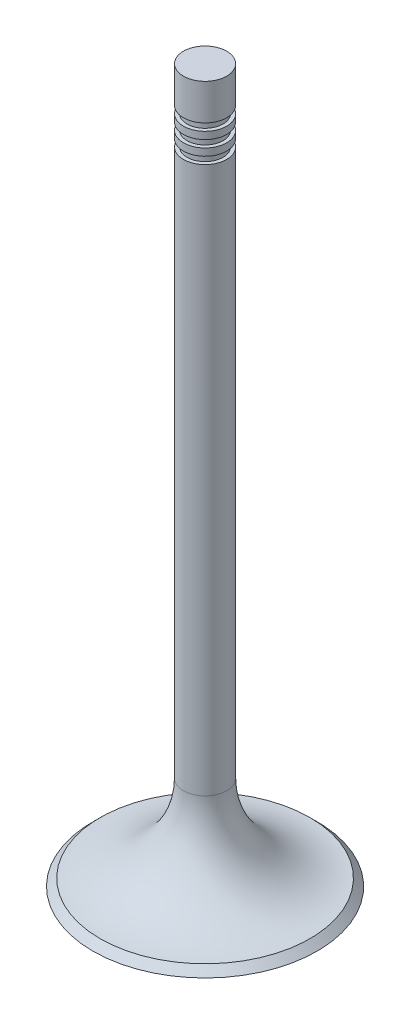
ISO-10303-21;
HEADER;
FILE_DESCRIPTION(('STEP AP214'),'2;1');
FILE_NAME('part.step','',(''),(''),'','','');
FILE_SCHEMA(('AUTOMOTIVE_DESIGN { 1 0 10303 214 1 1 1 1 }'));
ENDSEC;
DATA;
#1=APPLICATION_CONTEXT('core data for automotive mechanical design processes');
#2=APPLICATION_PROTOCOL_DEFINITION('international standard','automotive_design',2000,#1);
#3=PRODUCT_CONTEXT('',#1,'mechanical');
#4=PRODUCT('Part','Part','',(#3));
#5=PRODUCT_RELATED_PRODUCT_CATEGORY('part','',(#4));
#6=PRODUCT_DEFINITION_FORMATION('','',#4);
#7=PRODUCT_DEFINITION_CONTEXT('part definition',#1,'design');
#8=PRODUCT_DEFINITION('design','',#6,#7);
#9=PRODUCT_DEFINITION_SHAPE('','',#8);
#10=(LENGTH_UNIT() NAMED_UNIT(*) SI_UNIT(.MILLI.,.METRE.));
#11=(NAMED_UNIT(*) PLANE_ANGLE_UNIT() SI_UNIT($,.RADIAN.));
#12=(NAMED_UNIT(*) SI_UNIT($,.STERADIAN.) SOLID_ANGLE_UNIT());
#13=UNCERTAINTY_MEASURE_WITH_UNIT(LENGTH_MEASURE(1.E-05),#10,'distance_accuracy_value','');
#14=(GEOMETRIC_REPRESENTATION_CONTEXT(3) GLOBAL_UNCERTAINTY_ASSIGNED_CONTEXT((#13)) GLOBAL_UNIT_ASSIGNED_CONTEXT((#10,
#11,#12)) REPRESENTATION_CONTEXT('',''));
#15=CARTESIAN_POINT('',(0.,0.,0.));
#16=DIRECTION('',(0.,0.,1.));
#17=DIRECTION('',(1.,0.,0.));
#18=AXIS2_PLACEMENT_3D('',#15,#16,#17);
#19=CARTESIAN_POINT('',(0.,0.,0.));
#20=DIRECTION('',(0.,1.,0.));
#21=DIRECTION('',(0.,0.,1.));
#22=AXIS2_PLACEMENT_3D('',#19,#20,#21);
#23=PLANE('',#22);
#24=CARTESIAN_POINT('',(0.,0.,0.));
#25=DIRECTION('',(0.,1.,0.));
#26=DIRECTION('',(0.,0.,1.));
#27=AXIS2_PLACEMENT_3D('',#24,#25,#26);
#28=CIRCLE('',#27,15.55);
#29=CARTESIAN_POINT('',(0.,0.,15.55));
#30=VERTEX_POINT('',#29);
#31=EDGE_CURVE('E58',#30,#30,#28,.T.);
#32=ORIENTED_EDGE('',*,*,#31,.F.);
#33=EDGE_LOOP('',(#32));
#34=FACE_BOUND('',#33,.T.);
#35=ADVANCED_FACE('F45',(#34),#23,.F.);
#36=CARTESIAN_POINT('',(0.,1.,0.));
#37=DIRECTION('',(0.,-1.,0.));
#38=DIRECTION('',(0.,0.,-1.));
#39=AXIS2_PLACEMENT_3D('',#36,#37,#38);
#40=CONICAL_SURFACE('',#39,14.55,0.785398163397446);
#41=ORIENTED_EDGE('',*,*,#31,.T.);
#42=EDGE_LOOP('',(#41));
#43=FACE_BOUND('',#42,.T.);
#44=CARTESIAN_POINT('',(0.,1.,0.));
#45=DIRECTION('',(0.,1.,0.));
#46=DIRECTION('',(0.,0.,1.));
#47=AXIS2_PLACEMENT_3D('',#44,#45,#46);
#48=CIRCLE('',#47,14.55);
#49=CARTESIAN_POINT('',(0.,1.,14.55));
#50=VERTEX_POINT('',#49);
#51=EDGE_CURVE('E53',#50,#50,#48,.T.);
#52=ORIENTED_EDGE('',*,*,#51,.F.);
#53=EDGE_LOOP('',(#52));
#54=FACE_BOUND('',#53,.T.);
#55=ADVANCED_FACE('F152',(#43,#54),#40,.T.);
#56=CARTESIAN_POINT('',(0.,98.8,0.));
#57=DIRECTION('',(0.,-1.,0.));
#58=DIRECTION('',(0.,0.,-1.));
#59=AXIS2_PLACEMENT_3D('',#56,#57,#58);
#60=CYLINDRICAL_SURFACE('',#59,3.);
#61=CARTESIAN_POINT('',(0.,88.8,0.));
#62=DIRECTION('',(0.,1.,0.));
#63=DIRECTION('',(0.,0.,1.));
#64=AXIS2_PLACEMENT_3D('',#61,#62,#63);
#65=CIRCLE('',#64,3.);
#66=CARTESIAN_POINT('',(0.,88.8,3.));
#67=VERTEX_POINT('',#66);
#68=EDGE_CURVE('E79',#67,#67,#65,.T.);
#69=ORIENTED_EDGE('',*,*,#68,.F.);
#70=EDGE_LOOP('',(#69));
#71=FACE_BOUND('',#70,.T.);
#72=CARTESIAN_POINT('',(0.,12.9915595316039,0.));
#73=DIRECTION('',(0.,-1.,0.));
#74=DIRECTION('',(0.,0.,-1.));
#75=AXIS2_PLACEMENT_3D('',#72,#73,#74);
#76=CIRCLE('',#75,3.);
#77=CARTESIAN_POINT('',(0.,12.9915595316039,-3.));
#78=VERTEX_POINT('',#77);
#79=EDGE_CURVE('E10',#78,#78,#76,.F.);
#80=ORIENTED_EDGE('',*,*,#79,.T.);
#81=EDGE_LOOP('',(#80));
#82=FACE_BOUND('',#81,.T.);
#83=ADVANCED_FACE('F158',(#71,#82),#60,.T.);
#84=CARTESIAN_POINT('',(0.,12.9915595316039,0.));
#85=DIRECTION('',(0.,-1.,0.));
#86=DIRECTION('',(0.,0.,-1.));
#87=AXIS2_PLACEMENT_3D('',#84,#85,#86);
#88=TOROIDAL_SURFACE('',#87,15.,12.);
#89=ORIENTED_EDGE('',*,*,#51,.T.);
#90=EDGE_LOOP('',(#89));
#91=FACE_BOUND('',#90,.T.);
#92=ORIENTED_EDGE('',*,*,#79,.F.);
#93=EDGE_LOOP('',(#92));
#94=FACE_BOUND('',#93,.T.);
#95=ADVANCED_FACE('F47',(#91,#94),#88,.F.);
#96=CARTESIAN_POINT('',(0.,98.8,0.));
#97=DIRECTION('',(0.,1.,0.));
#98=DIRECTION('',(0.,0.,1.));
#99=AXIS2_PLACEMENT_3D('',#96,#97,#98);
#100=CYLINDRICAL_SURFACE('',#99,2.5);
#101=CARTESIAN_POINT('',(0.,88.8,0.));
#102=DIRECTION('',(0.,1.,0.));
#103=DIRECTION('',(0.,0.,1.));
#104=AXIS2_PLACEMENT_3D('',#101,#102,#103);
#105=CIRCLE('',#104,2.5);
#106=CARTESIAN_POINT('',(0.,88.8,2.5));
#107=VERTEX_POINT('',#106);
#108=EDGE_CURVE('E83',#107,#107,#105,.T.);
#109=ORIENTED_EDGE('',*,*,#108,.T.);
#110=EDGE_LOOP('',(#109));
#111=FACE_BOUND('',#110,.T.);
#112=CARTESIAN_POINT('',(0.,89.8,0.));
#113=DIRECTION('',(0.,1.,0.));
#114=DIRECTION('',(0.,0.,1.));
#115=AXIS2_PLACEMENT_3D('',#112,#113,#114);
#116=CIRCLE('',#115,2.5);
#117=CARTESIAN_POINT('',(0.,89.8,2.5));
#118=VERTEX_POINT('',#117);
#119=EDGE_CURVE('E70',#118,#118,#116,.T.);
#120=ORIENTED_EDGE('',*,*,#119,.F.);
#121=EDGE_LOOP('',(#120));
#122=FACE_BOUND('',#121,.T.);
#123=ADVANCED_FACE('F170',(#111,#122),#100,.T.);
#124=CARTESIAN_POINT('',(0.,89.8,0.));
#125=DIRECTION('',(0.,-1.,0.));
#126=DIRECTION('',(0.,0.,-1.));
#127=AXIS2_PLACEMENT_3D('',#124,#125,#126);
#128=PLANE('',#127);
#129=ORIENTED_EDGE('',*,*,#119,.T.);
#130=EDGE_LOOP('',(#129));
#131=FACE_BOUND('',#130,.T.);
#132=CARTESIAN_POINT('',(0.,89.8,0.));
#133=DIRECTION('',(0.,1.,0.));
#134=DIRECTION('',(0.,0.,1.));
#135=AXIS2_PLACEMENT_3D('',#132,#133,#134);
#136=CIRCLE('',#135,3.);
#137=CARTESIAN_POINT('',(0.,89.8,3.));
#138=VERTEX_POINT('',#137);
#139=EDGE_CURVE('E75',#138,#138,#136,.T.);
#140=ORIENTED_EDGE('',*,*,#139,.F.);
#141=EDGE_LOOP('',(#140));
#142=FACE_BOUND('',#141,.T.);
#143=ADVANCED_FACE('F173',(#131,#142),#128,.T.);
#144=CARTESIAN_POINT('',(0.,88.8,0.));
#145=DIRECTION('',(0.,-1.,0.));
#146=DIRECTION('',(0.,0.,-1.));
#147=AXIS2_PLACEMENT_3D('',#144,#145,#146);
#148=PLANE('',#147);
#149=ORIENTED_EDGE('',*,*,#108,.F.);
#150=EDGE_LOOP('',(#149));
#151=FACE_BOUND('',#150,.T.);
#152=ORIENTED_EDGE('',*,*,#68,.T.);
#153=EDGE_LOOP('',(#152));
#154=FACE_BOUND('',#153,.T.);
#155=ADVANCED_FACE('F177',(#151,#154),#148,.F.);
#156=CARTESIAN_POINT('',(0.,90.8,0.));
#157=DIRECTION('',(0.,1.,0.));
#158=DIRECTION('',(0.,0.,1.));
#159=AXIS2_PLACEMENT_3D('',#156,#157,#158);
#160=CIRCLE('',#159,3.);
#161=CARTESIAN_POINT('',(0.,90.8,3.));
#162=VERTEX_POINT('',#161);
#163=EDGE_CURVE('E96',#162,#162,#160,.T.);
#164=ORIENTED_EDGE('',*,*,#163,.F.);
#165=EDGE_LOOP('',(#164));
#166=FACE_BOUND('',#165,.T.);
#167=ORIENTED_EDGE('',*,*,#139,.T.);
#168=EDGE_LOOP('',(#167));
#169=FACE_BOUND('',#168,.T.);
#170=ADVANCED_FACE('F134',(#166,#169),#60,.T.);
#171=CARTESIAN_POINT('',(0.,98.8,0.));
#172=DIRECTION('',(0.,1.,0.));
#173=DIRECTION('',(0.,0.,1.));
#174=AXIS2_PLACEMENT_3D('',#171,#172,#173);
#175=CYLINDRICAL_SURFACE('',#174,2.5);
#176=CARTESIAN_POINT('',(0.,90.8,0.));
#177=DIRECTION('',(0.,1.,0.));
#178=DIRECTION('',(0.,0.,1.));
#179=AXIS2_PLACEMENT_3D('',#176,#177,#178);
#180=CIRCLE('',#179,2.5);
#181=CARTESIAN_POINT('',(0.,90.8,2.5));
#182=VERTEX_POINT('',#181);
#183=EDGE_CURVE('E74',#182,#182,#180,.T.);
#184=ORIENTED_EDGE('',*,*,#183,.T.);
#185=EDGE_LOOP('',(#184));
#186=FACE_BOUND('',#185,.T.);
#187=CARTESIAN_POINT('',(0.,91.8,0.));
#188=DIRECTION('',(0.,1.,0.));
#189=DIRECTION('',(0.,0.,1.));
#190=AXIS2_PLACEMENT_3D('',#187,#188,#189);
#191=CIRCLE('',#190,2.5);
#192=CARTESIAN_POINT('',(0.,91.8,2.5));
#193=VERTEX_POINT('',#192);
#194=EDGE_CURVE('E87',#193,#193,#191,.T.);
#195=ORIENTED_EDGE('',*,*,#194,.F.);
#196=EDGE_LOOP('',(#195));
#197=FACE_BOUND('',#196,.T.);
#198=ADVANCED_FACE('F140',(#186,#197),#175,.T.);
#199=CARTESIAN_POINT('',(0.,91.8,0.));
#200=DIRECTION('',(0.,-1.,0.));
#201=DIRECTION('',(0.,0.,-1.));
#202=AXIS2_PLACEMENT_3D('',#199,#200,#201);
#203=PLANE('',#202);
#204=ORIENTED_EDGE('',*,*,#194,.T.);
#205=EDGE_LOOP('',(#204));
#206=FACE_BOUND('',#205,.T.);
#207=CARTESIAN_POINT('',(0.,91.8,0.));
#208=DIRECTION('',(0.,1.,0.));
#209=DIRECTION('',(0.,0.,1.));
#210=AXIS2_PLACEMENT_3D('',#207,#208,#209);
#211=CIRCLE('',#210,3.);
#212=CARTESIAN_POINT('',(0.,91.8,3.));
#213=VERTEX_POINT('',#212);
#214=EDGE_CURVE('E92',#213,#213,#211,.T.);
#215=ORIENTED_EDGE('',*,*,#214,.F.);
#216=EDGE_LOOP('',(#215));
#217=FACE_BOUND('',#216,.T.);
#218=ADVANCED_FACE('F138',(#206,#217),#203,.T.);
#219=CARTESIAN_POINT('',(0.,90.8,0.));
#220=DIRECTION('',(0.,-1.,0.));
#221=DIRECTION('',(0.,0.,-1.));
#222=AXIS2_PLACEMENT_3D('',#219,#220,#221);
#223=PLANE('',#222);
#224=ORIENTED_EDGE('',*,*,#183,.F.);
#225=EDGE_LOOP('',(#224));
#226=FACE_BOUND('',#225,.T.);
#227=ORIENTED_EDGE('',*,*,#163,.T.);
#228=EDGE_LOOP('',(#227));
#229=FACE_BOUND('',#228,.T.);
#230=ADVANCED_FACE('F132',(#226,#229),#223,.F.);
#231=CARTESIAN_POINT('',(0.,92.8,0.));
#232=DIRECTION('',(0.,1.,0.));
#233=DIRECTION('',(0.,0.,1.));
#234=AXIS2_PLACEMENT_3D('',#231,#232,#233);
#235=CIRCLE('',#234,3.);
#236=CARTESIAN_POINT('',(0.,92.8,3.));
#237=VERTEX_POINT('',#236);
#238=EDGE_CURVE('E110',#237,#237,#235,.T.);
#239=ORIENTED_EDGE('',*,*,#238,.F.);
#240=EDGE_LOOP('',(#239));
#241=FACE_BOUND('',#240,.T.);
#242=ORIENTED_EDGE('',*,*,#214,.T.);
#243=EDGE_LOOP('',(#242));
#244=FACE_BOUND('',#243,.T.);
#245=ADVANCED_FACE('F129',(#241,#244),#60,.T.);
#246=CARTESIAN_POINT('',(0.,98.8,0.));
#247=DIRECTION('',(0.,1.,0.));
#248=DIRECTION('',(0.,0.,1.));
#249=AXIS2_PLACEMENT_3D('',#246,#247,#248);
#250=CYLINDRICAL_SURFACE('',#249,2.5);
#251=CARTESIAN_POINT('',(0.,92.8,0.));
#252=DIRECTION('',(0.,1.,0.));
#253=DIRECTION('',(0.,0.,1.));
#254=AXIS2_PLACEMENT_3D('',#251,#252,#253);
#255=CIRCLE('',#254,2.5);
#256=CARTESIAN_POINT('',(0.,92.8,2.5));
#257=VERTEX_POINT('',#256);
#258=EDGE_CURVE('E91',#257,#257,#255,.T.);
#259=ORIENTED_EDGE('',*,*,#258,.T.);
#260=EDGE_LOOP('',(#259));
#261=FACE_BOUND('',#260,.T.);
#262=CARTESIAN_POINT('',(0.,93.8,0.));
#263=DIRECTION('',(0.,1.,0.));
#264=DIRECTION('',(0.,0.,1.));
#265=AXIS2_PLACEMENT_3D('',#262,#263,#264);
#266=CIRCLE('',#265,2.5);
#267=CARTESIAN_POINT('',(0.,93.8,2.5));
#268=VERTEX_POINT('',#267);
#269=EDGE_CURVE('E69',#268,#268,#266,.T.);
#270=ORIENTED_EDGE('',*,*,#269,.F.);
#271=EDGE_LOOP('',(#270));
#272=FACE_BOUND('',#271,.T.);
#273=ADVANCED_FACE('F118',(#261,#272),#250,.T.);
#274=CARTESIAN_POINT('',(0.,93.8,0.));
#275=DIRECTION('',(0.,-1.,0.));
#276=DIRECTION('',(0.,0.,-1.));
#277=AXIS2_PLACEMENT_3D('',#274,#275,#276);
#278=PLANE('',#277);
#279=ORIENTED_EDGE('',*,*,#269,.T.);
#280=EDGE_LOOP('',(#279));
#281=FACE_BOUND('',#280,.T.);
#282=CARTESIAN_POINT('',(0.,93.8,0.));
#283=DIRECTION('',(0.,1.,0.));
#284=DIRECTION('',(0.,0.,1.));
#285=AXIS2_PLACEMENT_3D('',#282,#283,#284);
#286=CIRCLE('',#285,3.);
#287=CARTESIAN_POINT('',(0.,93.8,3.));
#288=VERTEX_POINT('',#287);
#289=EDGE_CURVE('E106',#288,#288,#286,.T.);
#290=ORIENTED_EDGE('',*,*,#289,.F.);
#291=EDGE_LOOP('',(#290));
#292=FACE_BOUND('',#291,.T.);
#293=ADVANCED_FACE('F125',(#281,#292),#278,.T.);
#294=CARTESIAN_POINT('',(0.,92.8,0.));
#295=DIRECTION('',(0.,-1.,0.));
#296=DIRECTION('',(0.,0.,-1.));
#297=AXIS2_PLACEMENT_3D('',#294,#295,#296);
#298=PLANE('',#297);
#299=ORIENTED_EDGE('',*,*,#258,.F.);
#300=EDGE_LOOP('',(#299));
#301=FACE_BOUND('',#300,.T.);
#302=ORIENTED_EDGE('',*,*,#238,.T.);
#303=EDGE_LOOP('',(#302));
#304=FACE_BOUND('',#303,.T.);
#305=ADVANCED_FACE('F121',(#301,#304),#298,.F.);
#306=CARTESIAN_POINT('',(0.,98.8,0.));
#307=DIRECTION('',(0.,1.,0.));
#308=DIRECTION('',(0.,0.,1.));
#309=AXIS2_PLACEMENT_3D('',#306,#307,#308);
#310=PLANE('',#309);
#311=CARTESIAN_POINT('',(0.,98.8,0.));
#312=DIRECTION('',(0.,1.,0.));
#313=DIRECTION('',(0.,0.,1.));
#314=AXIS2_PLACEMENT_3D('',#311,#312,#313);
#315=CIRCLE('',#314,3.);
#316=CARTESIAN_POINT('',(0.,98.8,3.));
#317=VERTEX_POINT('',#316);
#318=EDGE_CURVE('E63',#317,#317,#315,.T.);
#319=ORIENTED_EDGE('',*,*,#318,.T.);
#320=EDGE_LOOP('',(#319));
#321=FACE_BOUND('',#320,.T.);
#322=ADVANCED_FACE('F124',(#321),#310,.T.);
#323=ORIENTED_EDGE('',*,*,#318,.F.);
#324=EDGE_LOOP('',(#323));
#325=FACE_BOUND('',#324,.T.);
#326=ORIENTED_EDGE('',*,*,#289,.T.);
#327=EDGE_LOOP('',(#326));
#328=FACE_BOUND('',#327,.T.);
#329=ADVANCED_FACE('F135',(#325,#328),#60,.T.);
#330=CLOSED_SHELL('',(#35,#55,#83,#95,#123,#143,#155,#170,#198,#218,#230,#245,#273,#293,#305,
#322,#329));
#331=MANIFOLD_SOLID_BREP('B2',#330);
#332=ADVANCED_BREP_SHAPE_REPRESENTATION('',(#18,#331),#14);
#333=SHAPE_DEFINITION_REPRESENTATION(#9,#332);
ENDSEC;
END-ISO-10303-21;
